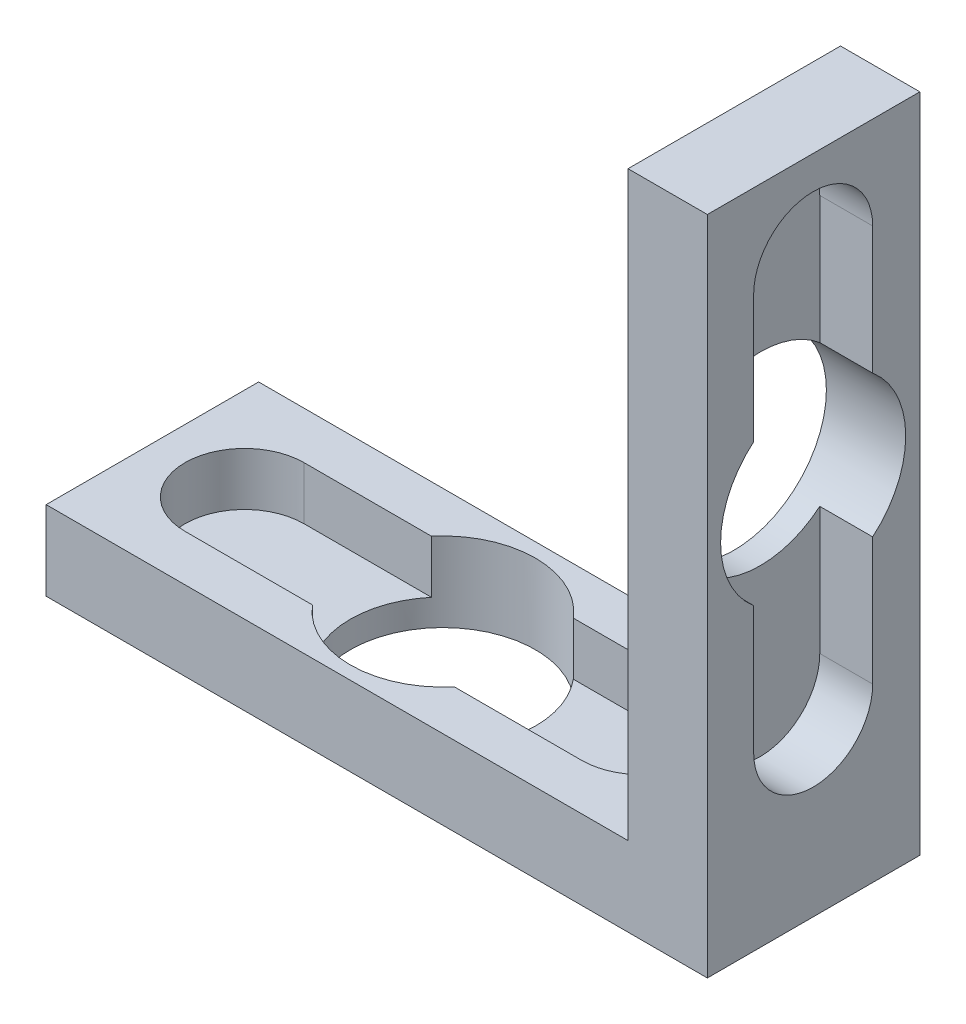
ISO-10303-21;
HEADER;
FILE_DESCRIPTION(('STEP AP214'),'2;1');
FILE_NAME('part.step','',(''),(''),'','','');
FILE_SCHEMA(('AUTOMOTIVE_DESIGN { 1 0 10303 214 1 1 1 1 }'));
ENDSEC;
DATA;
#1=APPLICATION_CONTEXT('core data for automotive mechanical design processes');
#2=APPLICATION_PROTOCOL_DEFINITION('international standard','automotive_design',2000,#1);
#3=PRODUCT_CONTEXT('',#1,'mechanical');
#4=PRODUCT('Part','Part','',(#3));
#5=PRODUCT_RELATED_PRODUCT_CATEGORY('part','',(#4));
#6=PRODUCT_DEFINITION_FORMATION('','',#4);
#7=PRODUCT_DEFINITION_CONTEXT('part definition',#1,'design');
#8=PRODUCT_DEFINITION('design','',#6,#7);
#9=PRODUCT_DEFINITION_SHAPE('','',#8);
#10=(LENGTH_UNIT() NAMED_UNIT(*) SI_UNIT(.MILLI.,.METRE.));
#11=(NAMED_UNIT(*) PLANE_ANGLE_UNIT() SI_UNIT($,.RADIAN.));
#12=(NAMED_UNIT(*) SI_UNIT($,.STERADIAN.) SOLID_ANGLE_UNIT());
#13=UNCERTAINTY_MEASURE_WITH_UNIT(LENGTH_MEASURE(1.E-05),#10,'distance_accuracy_value','');
#14=(GEOMETRIC_REPRESENTATION_CONTEXT(3) GLOBAL_UNCERTAINTY_ASSIGNED_CONTEXT((#13)) GLOBAL_UNIT_ASSIGNED_CONTEXT((#10,
#11,#12)) REPRESENTATION_CONTEXT('',''));
#15=CARTESIAN_POINT('',(0.,0.,0.));
#16=DIRECTION('',(0.,0.,1.));
#17=DIRECTION('',(1.,0.,0.));
#18=AXIS2_PLACEMENT_3D('',#15,#16,#17);
#19=CARTESIAN_POINT('',(0.,3.,0.));
#20=DIRECTION('',(1.,0.,0.));
#21=DIRECTION('',(0.,0.,-1.));
#22=AXIS2_PLACEMENT_3D('',#19,#20,#21);
#23=PLANE('',#22);
#24=DIRECTION('',(0.,0.,1.));
#25=VECTOR('',#24,1.);
#26=CARTESIAN_POINT('',(0.,0.,0.));
#27=LINE('',#26,#25);
#28=CARTESIAN_POINT('',(0.,0.,0.));
#29=VERTEX_POINT('',#28);
#30=CARTESIAN_POINT('',(0.,0.,8.03388090349078));
#31=VERTEX_POINT('',#30);
#32=EDGE_CURVE('E284',#29,#31,#27,.T.);
#33=ORIENTED_EDGE('',*,*,#32,.T.);
#34=DIRECTION('',(0.,-1.,0.));
#35=VECTOR('',#34,1.);
#36=CARTESIAN_POINT('',(0.,3.,8.03388090349078));
#37=LINE('',#36,#35);
#38=CARTESIAN_POINT('',(0.,3.,8.03388090349078));
#39=VERTEX_POINT('',#38);
#40=EDGE_CURVE('E309',#39,#31,#37,.T.);
#41=ORIENTED_EDGE('',*,*,#40,.F.);
#42=DIRECTION('',(0.,0.,1.));
#43=VECTOR('',#42,1.);
#44=CARTESIAN_POINT('',(0.,3.,0.));
#45=LINE('',#44,#43);
#46=CARTESIAN_POINT('',(0.,3.,0.));
#47=VERTEX_POINT('',#46);
#48=EDGE_CURVE('E285',#47,#39,#45,.T.);
#49=ORIENTED_EDGE('',*,*,#48,.F.);
#50=DIRECTION('',(0.,-1.,0.));
#51=VECTOR('',#50,1.);
#52=CARTESIAN_POINT('',(0.,3.,0.));
#53=LINE('',#52,#51);
#54=EDGE_CURVE('E293',#47,#29,#53,.T.);
#55=ORIENTED_EDGE('',*,*,#54,.T.);
#56=EDGE_LOOP('',(#33,#41,#49,#55));
#57=FACE_BOUND('',#56,.T.);
#58=ADVANCED_FACE('F35',(#57),#23,.F.);
#59=CARTESIAN_POINT('',(0.,3.,8.03388090349078));
#60=DIRECTION('',(0.,0.,-1.));
#61=DIRECTION('',(-1.,0.,0.));
#62=AXIS2_PLACEMENT_3D('',#59,#60,#61);
#63=PLANE('',#62);
#64=DIRECTION('',(1.,0.,0.));
#65=VECTOR('',#64,1.);
#66=CARTESIAN_POINT('',(0.,0.,8.03388090349078));
#67=LINE('',#66,#65);
#68=CARTESIAN_POINT('',(25.,0.,8.03388090349078));
#69=VERTEX_POINT('',#68);
#70=EDGE_CURVE('E296',#31,#69,#67,.T.);
#71=ORIENTED_EDGE('',*,*,#70,.T.);
#72=DIRECTION('',(0.,-1.,0.));
#73=VECTOR('',#72,1.);
#74=CARTESIAN_POINT('',(25.,3.,8.03388090349078));
#75=LINE('',#74,#73);
#76=CARTESIAN_POINT('',(25.,25.,8.03388090349078));
#77=VERTEX_POINT('',#76);
#78=EDGE_CURVE('E306',#77,#69,#75,.T.);
#79=ORIENTED_EDGE('',*,*,#78,.F.);
#80=DIRECTION('',(1.,0.,0.));
#81=VECTOR('',#80,1.);
#82=CARTESIAN_POINT('',(25.,25.,8.03388090349078));
#83=LINE('',#82,#81);
#84=CARTESIAN_POINT('',(22.,25.,8.03388090349078));
#85=VERTEX_POINT('',#84);
#86=EDGE_CURVE('E273',#85,#77,#83,.T.);
#87=ORIENTED_EDGE('',*,*,#86,.F.);
#88=DIRECTION('',(0.,-1.,0.));
#89=VECTOR('',#88,1.);
#90=CARTESIAN_POINT('',(22.,25.,8.03388090349078));
#91=LINE('',#90,#89);
#92=CARTESIAN_POINT('',(22.,3.,8.03388090349078));
#93=VERTEX_POINT('',#92);
#94=EDGE_CURVE('E276',#85,#93,#91,.T.);
#95=ORIENTED_EDGE('',*,*,#94,.T.);
#96=DIRECTION('',(1.,0.,0.));
#97=VECTOR('',#96,1.);
#98=CARTESIAN_POINT('',(0.,3.,8.03388090349078));
#99=LINE('',#98,#97);
#100=EDGE_CURVE('E288',#39,#93,#99,.T.);
#101=ORIENTED_EDGE('',*,*,#100,.F.);
#102=ORIENTED_EDGE('',*,*,#40,.T.);
#103=EDGE_LOOP('',(#71,#79,#87,#95,#101,#102));
#104=FACE_BOUND('',#103,.T.);
#105=ADVANCED_FACE('F374',(#104),#63,.F.);
#106=CARTESIAN_POINT('',(25.,3.,0.));
#107=DIRECTION('',(-1.,0.,0.));
#108=DIRECTION('',(0.,0.,1.));
#109=AXIS2_PLACEMENT_3D('',#106,#107,#108);
#110=PLANE('',#109);
#111=DIRECTION('',(0.,-1.,0.));
#112=VECTOR('',#111,1.);
#113=CARTESIAN_POINT('',(25.,6.5,6.28388090349078));
#114=LINE('',#113,#112);
#115=CARTESIAN_POINT('',(25.,21.5,6.28388090349077));
#116=VERTEX_POINT('',#115);
#117=CARTESIAN_POINT('',(25.,16.6809513236909,6.28388090349078));
#118=VERTEX_POINT('',#117);
#119=EDGE_CURVE('E205',#116,#118,#114,.T.);
#120=ORIENTED_EDGE('',*,*,#119,.F.);
#121=CARTESIAN_POINT('',(25.,21.5,4.03388090349078));
#122=DIRECTION('',(1.,0.,0.));
#123=DIRECTION('',(0.,0.,-1.));
#124=AXIS2_PLACEMENT_3D('',#121,#122,#123);
#125=CIRCLE('',#124,2.25);
#126=CARTESIAN_POINT('',(25.,21.5,1.78388090349078));
#127=VERTEX_POINT('',#126);
#128=EDGE_CURVE('E186',#127,#116,#125,.T.);
#129=ORIENTED_EDGE('',*,*,#128,.F.);
#130=DIRECTION('',(0.,1.,0.));
#131=VECTOR('',#130,1.);
#132=CARTESIAN_POINT('',(25.,6.5,1.78388090349078));
#133=LINE('',#132,#131);
#134=CARTESIAN_POINT('',(25.,16.6809513236909,1.78388090349078));
#135=VERTEX_POINT('',#134);
#136=EDGE_CURVE('E202',#135,#127,#133,.T.);
#137=ORIENTED_EDGE('',*,*,#136,.F.);
#138=CARTESIAN_POINT('',(25.,14.,4.03388090349078));
#139=DIRECTION('',(1.,0.,0.));
#140=DIRECTION('',(0.,0.,-1.));
#141=AXIS2_PLACEMENT_3D('',#138,#139,#140);
#142=CIRCLE('',#141,3.5);
#143=CARTESIAN_POINT('',(25.,11.3190486763091,1.78388090349078));
#144=VERTEX_POINT('',#143);
#145=EDGE_CURVE('E217',#144,#135,#142,.T.);
#146=ORIENTED_EDGE('',*,*,#145,.F.);
#147=CARTESIAN_POINT('',(25.,6.5,1.78388090349078));
#148=VERTEX_POINT('',#147);
#149=EDGE_CURVE('E210',#148,#144,#133,.T.);
#150=ORIENTED_EDGE('',*,*,#149,.F.);
#151=CARTESIAN_POINT('',(25.,6.5,4.03388090349078));
#152=DIRECTION('',(1.,0.,0.));
#153=DIRECTION('',(0.,0.,-1.));
#154=AXIS2_PLACEMENT_3D('',#151,#152,#153);
#155=CIRCLE('',#154,2.25);
#156=CARTESIAN_POINT('',(25.,6.5,6.28388090349078));
#157=VERTEX_POINT('',#156);
#158=EDGE_CURVE('E351',#157,#148,#155,.T.);
#159=ORIENTED_EDGE('',*,*,#158,.F.);
#160=CARTESIAN_POINT('',(25.,11.3190486763091,6.28388090349078));
#161=VERTEX_POINT('',#160);
#162=EDGE_CURVE('E213',#161,#157,#114,.T.);
#163=ORIENTED_EDGE('',*,*,#162,.F.);
#164=EDGE_CURVE('E227',#118,#161,#142,.T.);
#165=ORIENTED_EDGE('',*,*,#164,.F.);
#166=EDGE_LOOP('',(#120,#129,#137,#146,#150,#159,#163,#165));
#167=FACE_BOUND('',#166,.T.);
#168=DIRECTION('',(0.,0.,-1.));
#169=VECTOR('',#168,1.);
#170=CARTESIAN_POINT('',(25.,0.,0.));
#171=LINE('',#170,#169);
#172=CARTESIAN_POINT('',(25.,0.,0.));
#173=VERTEX_POINT('',#172);
#174=EDGE_CURVE('E298',#69,#173,#171,.T.);
#175=ORIENTED_EDGE('',*,*,#174,.T.);
#176=DIRECTION('',(0.,-1.,0.));
#177=VECTOR('',#176,1.);
#178=CARTESIAN_POINT('',(25.,3.,0.));
#179=LINE('',#178,#177);
#180=CARTESIAN_POINT('',(25.,25.,0.));
#181=VERTEX_POINT('',#180);
#182=EDGE_CURVE('E303',#181,#173,#179,.T.);
#183=ORIENTED_EDGE('',*,*,#182,.F.);
#184=DIRECTION('',(0.,0.,-1.));
#185=VECTOR('',#184,1.);
#186=CARTESIAN_POINT('',(25.,25.,8.03388090349078));
#187=LINE('',#186,#185);
#188=EDGE_CURVE('E266',#77,#181,#187,.T.);
#189=ORIENTED_EDGE('',*,*,#188,.F.);
#190=ORIENTED_EDGE('',*,*,#78,.T.);
#191=EDGE_LOOP('',(#175,#183,#189,#190));
#192=FACE_BOUND('',#191,.T.);
#193=ADVANCED_FACE('F199',(#167,#192),#110,.F.);
#194=CARTESIAN_POINT('',(0.,3.,0.));
#195=DIRECTION('',(0.,0.,1.));
#196=DIRECTION('',(1.,0.,0.));
#197=AXIS2_PLACEMENT_3D('',#194,#195,#196);
#198=PLANE('',#197);
#199=DIRECTION('',(-1.,0.,0.));
#200=VECTOR('',#199,1.);
#201=CARTESIAN_POINT('',(0.,0.,0.));
#202=LINE('',#201,#200);
#203=EDGE_CURVE('E289',#173,#29,#202,.T.);
#204=ORIENTED_EDGE('',*,*,#203,.T.);
#205=ORIENTED_EDGE('',*,*,#54,.F.);
#206=DIRECTION('',(-1.,0.,0.));
#207=VECTOR('',#206,1.);
#208=CARTESIAN_POINT('',(0.,3.,0.));
#209=LINE('',#208,#207);
#210=CARTESIAN_POINT('',(22.,3.,0.));
#211=VERTEX_POINT('',#210);
#212=EDGE_CURVE('E291',#211,#47,#209,.T.);
#213=ORIENTED_EDGE('',*,*,#212,.F.);
#214=DIRECTION('',(0.,-1.,0.));
#215=VECTOR('',#214,1.);
#216=CARTESIAN_POINT('',(22.,25.,0.));
#217=LINE('',#216,#215);
#218=CARTESIAN_POINT('',(22.,25.,0.));
#219=VERTEX_POINT('',#218);
#220=EDGE_CURVE('E281',#219,#211,#217,.T.);
#221=ORIENTED_EDGE('',*,*,#220,.F.);
#222=DIRECTION('',(-1.,0.,0.));
#223=VECTOR('',#222,1.);
#224=CARTESIAN_POINT('',(25.,25.,0.));
#225=LINE('',#224,#223);
#226=EDGE_CURVE('E269',#181,#219,#225,.T.);
#227=ORIENTED_EDGE('',*,*,#226,.F.);
#228=ORIENTED_EDGE('',*,*,#182,.T.);
#229=EDGE_LOOP('',(#204,#205,#213,#221,#227,#228));
#230=FACE_BOUND('',#229,.T.);
#231=ADVANCED_FACE('F395',(#230),#198,.F.);
#232=CARTESIAN_POINT('',(0.,3.,0.));
#233=DIRECTION('',(0.,1.,0.));
#234=DIRECTION('',(0.,0.,1.));
#235=AXIS2_PLACEMENT_3D('',#232,#233,#234);
#236=PLANE('',#235);
#237=CARTESIAN_POINT('',(3.5,3.,4.03388090349078));
#238=DIRECTION('',(0.,1.,0.));
#239=DIRECTION('',(0.,0.,1.));
#240=AXIS2_PLACEMENT_3D('',#237,#238,#239);
#241=CIRCLE('',#240,2.25);
#242=CARTESIAN_POINT('',(3.5,3.,1.78388090349078));
#243=VERTEX_POINT('',#242);
#244=CARTESIAN_POINT('',(3.5,3.,6.28388090349078));
#245=VERTEX_POINT('',#244);
#246=EDGE_CURVE('E226',#243,#245,#241,.T.);
#247=ORIENTED_EDGE('',*,*,#246,.F.);
#248=DIRECTION('',(-1.,0.,0.));
#249=VECTOR('',#248,1.);
#250=CARTESIAN_POINT('',(18.5,3.,1.78388090349078));
#251=LINE('',#250,#249);
#252=CARTESIAN_POINT('',(8.3190486763091,3.,1.78388090349078));
#253=VERTEX_POINT('',#252);
#254=EDGE_CURVE('E235',#253,#243,#251,.T.);
#255=ORIENTED_EDGE('',*,*,#254,.F.);
#256=CARTESIAN_POINT('',(11.,3.,4.03388090349078));
#257=DIRECTION('',(0.,1.,0.));
#258=DIRECTION('',(0.,0.,1.));
#259=AXIS2_PLACEMENT_3D('',#256,#257,#258);
#260=CIRCLE('',#259,3.5);
#261=CARTESIAN_POINT('',(13.6809513236909,3.,1.78388090349078));
#262=VERTEX_POINT('',#261);
#263=EDGE_CURVE('E263',#262,#253,#260,.T.);
#264=ORIENTED_EDGE('',*,*,#263,.F.);
#265=CARTESIAN_POINT('',(18.5,3.,1.78388090349078));
#266=VERTEX_POINT('',#265);
#267=EDGE_CURVE('E244',#266,#262,#251,.T.);
#268=ORIENTED_EDGE('',*,*,#267,.F.);
#269=CARTESIAN_POINT('',(18.5,3.,4.03388090349078));
#270=DIRECTION('',(0.,1.,0.));
#271=DIRECTION('',(0.,0.,1.));
#272=AXIS2_PLACEMENT_3D('',#269,#270,#271);
#273=CIRCLE('',#272,2.25);
#274=CARTESIAN_POINT('',(18.5,3.,6.28388090349077));
#275=VERTEX_POINT('',#274);
#276=EDGE_CURVE('E231',#275,#266,#273,.T.);
#277=ORIENTED_EDGE('',*,*,#276,.F.);
#278=DIRECTION('',(1.,0.,0.));
#279=VECTOR('',#278,1.);
#280=CARTESIAN_POINT('',(18.5,3.,6.28388090349078));
#281=LINE('',#280,#279);
#282=CARTESIAN_POINT('',(13.6809513236909,3.,6.28388090349078));
#283=VERTEX_POINT('',#282);
#284=EDGE_CURVE('E246',#283,#275,#281,.T.);
#285=ORIENTED_EDGE('',*,*,#284,.F.);
#286=CARTESIAN_POINT('',(8.3190486763091,3.,6.28388090349078));
#287=VERTEX_POINT('',#286);
#288=EDGE_CURVE('E251',#287,#283,#260,.T.);
#289=ORIENTED_EDGE('',*,*,#288,.F.);
#290=EDGE_CURVE('E247',#245,#287,#281,.T.);
#291=ORIENTED_EDGE('',*,*,#290,.F.);
#292=EDGE_LOOP('',(#247,#255,#264,#268,#277,#285,#289,#291));
#293=FACE_BOUND('',#292,.T.);
#294=DIRECTION('',(0.,0.,1.));
#295=VECTOR('',#294,1.);
#296=CARTESIAN_POINT('',(22.,3.,8.03388090349078));
#297=LINE('',#296,#295);
#298=EDGE_CURVE('E262',#211,#93,#297,.T.);
#299=ORIENTED_EDGE('',*,*,#298,.F.);
#300=ORIENTED_EDGE('',*,*,#212,.T.);
#301=ORIENTED_EDGE('',*,*,#48,.T.);
#302=ORIENTED_EDGE('',*,*,#100,.T.);
#303=EDGE_LOOP('',(#299,#300,#301,#302));
#304=FACE_BOUND('',#303,.T.);
#305=ADVANCED_FACE('F391',(#293,#304),#236,.T.);
#306=CARTESIAN_POINT('',(0.,0.,0.));
#307=DIRECTION('',(0.,1.,0.));
#308=DIRECTION('',(0.,0.,1.));
#309=AXIS2_PLACEMENT_3D('',#306,#307,#308);
#310=PLANE('',#309);
#311=CARTESIAN_POINT('',(11.,0.,4.03388090349078));
#312=DIRECTION('',(0.,1.,0.));
#313=DIRECTION('',(0.,0.,1.));
#314=AXIS2_PLACEMENT_3D('',#311,#312,#313);
#315=CIRCLE('',#314,3.5);
#316=CARTESIAN_POINT('',(11.,0.,7.53388090349078));
#317=VERTEX_POINT('',#316);
#318=EDGE_CURVE('E259',#317,#317,#315,.T.);
#319=ORIENTED_EDGE('',*,*,#318,.T.);
#320=EDGE_LOOP('',(#319));
#321=FACE_BOUND('',#320,.T.);
#322=ORIENTED_EDGE('',*,*,#32,.F.);
#323=ORIENTED_EDGE('',*,*,#203,.F.);
#324=ORIENTED_EDGE('',*,*,#174,.F.);
#325=ORIENTED_EDGE('',*,*,#70,.F.);
#326=EDGE_LOOP('',(#322,#323,#324,#325));
#327=FACE_BOUND('',#326,.T.);
#328=ADVANCED_FACE('F386',(#321,#327),#310,.F.);
#329=CARTESIAN_POINT('',(22.,25.,8.03388090349078));
#330=DIRECTION('',(1.,0.,0.));
#331=DIRECTION('',(0.,0.,-1.));
#332=AXIS2_PLACEMENT_3D('',#329,#330,#331);
#333=PLANE('',#332);
#334=CARTESIAN_POINT('',(22.,14.,4.03388090349078));
#335=DIRECTION('',(1.,0.,0.));
#336=DIRECTION('',(0.,0.,-1.));
#337=AXIS2_PLACEMENT_3D('',#334,#335,#336);
#338=CIRCLE('',#337,3.5);
#339=CARTESIAN_POINT('',(22.,14.,0.533880903490777));
#340=VERTEX_POINT('',#339);
#341=EDGE_CURVE('E223',#340,#340,#338,.T.);
#342=ORIENTED_EDGE('',*,*,#341,.T.);
#343=EDGE_LOOP('',(#342));
#344=FACE_BOUND('',#343,.T.);
#345=ORIENTED_EDGE('',*,*,#298,.T.);
#346=ORIENTED_EDGE('',*,*,#94,.F.);
#347=DIRECTION('',(0.,0.,1.));
#348=VECTOR('',#347,1.);
#349=CARTESIAN_POINT('',(22.,25.,8.03388090349078));
#350=LINE('',#349,#348);
#351=EDGE_CURVE('E271',#219,#85,#350,.T.);
#352=ORIENTED_EDGE('',*,*,#351,.F.);
#353=ORIENTED_EDGE('',*,*,#220,.T.);
#354=EDGE_LOOP('',(#345,#346,#352,#353));
#355=FACE_BOUND('',#354,.T.);
#356=ADVANCED_FACE('F402',(#344,#355),#333,.F.);
#357=CARTESIAN_POINT('',(0.,25.,0.));
#358=DIRECTION('',(0.,1.,0.));
#359=DIRECTION('',(0.,0.,1.));
#360=AXIS2_PLACEMENT_3D('',#357,#358,#359);
#361=PLANE('',#360);
#362=ORIENTED_EDGE('',*,*,#188,.T.);
#363=ORIENTED_EDGE('',*,*,#226,.T.);
#364=ORIENTED_EDGE('',*,*,#351,.T.);
#365=ORIENTED_EDGE('',*,*,#86,.T.);
#366=EDGE_LOOP('',(#362,#363,#364,#365));
#367=FACE_BOUND('',#366,.T.);
#368=ADVANCED_FACE('F399',(#367),#361,.T.);
#369=CARTESIAN_POINT('',(11.,0.,4.03388090349078));
#370=DIRECTION('',(0.,1.,0.));
#371=DIRECTION('',(0.,0.,1.));
#372=AXIS2_PLACEMENT_3D('',#369,#370,#371);
#373=CYLINDRICAL_SURFACE('',#372,3.5);
#374=CARTESIAN_POINT('',(11.,1.,4.03388090349078));
#375=DIRECTION('',(0.,1.,0.));
#376=DIRECTION('',(0.,0.,1.));
#377=AXIS2_PLACEMENT_3D('',#374,#375,#376);
#378=CIRCLE('',#377,3.5);
#379=CARTESIAN_POINT('',(8.3190486763091,1.,6.28388090349078));
#380=VERTEX_POINT('',#379);
#381=CARTESIAN_POINT('',(8.3190486763091,1.,1.78388090349078));
#382=VERTEX_POINT('',#381);
#383=EDGE_CURVE('E315',#380,#382,#378,.F.);
#384=ORIENTED_EDGE('',*,*,#383,.F.);
#385=DIRECTION('',(0.,1.,0.));
#386=VECTOR('',#385,1.);
#387=CARTESIAN_POINT('',(8.3190486763091,0.,6.28388090349078));
#388=LINE('',#387,#386);
#389=EDGE_CURVE('E324',#380,#287,#388,.T.);
#390=ORIENTED_EDGE('',*,*,#389,.T.);
#391=ORIENTED_EDGE('',*,*,#288,.T.);
#392=DIRECTION('',(0.,1.,0.));
#393=VECTOR('',#392,1.);
#394=CARTESIAN_POINT('',(13.6809513236909,0.,6.28388090349078));
#395=LINE('',#394,#393);
#396=CARTESIAN_POINT('',(13.6809513236909,1.,6.28388090349078));
#397=VERTEX_POINT('',#396);
#398=EDGE_CURVE('E318',#283,#397,#395,.F.);
#399=ORIENTED_EDGE('',*,*,#398,.T.);
#400=CARTESIAN_POINT('',(13.6809513236909,1.,1.78388090349078));
#401=VERTEX_POINT('',#400);
#402=EDGE_CURVE('E312',#401,#397,#378,.F.);
#403=ORIENTED_EDGE('',*,*,#402,.F.);
#404=DIRECTION('',(0.,1.,0.));
#405=VECTOR('',#404,1.);
#406=CARTESIAN_POINT('',(13.6809513236909,0.,1.78388090349078));
#407=LINE('',#406,#405);
#408=EDGE_CURVE('E314',#401,#262,#407,.T.);
#409=ORIENTED_EDGE('',*,*,#408,.T.);
#410=ORIENTED_EDGE('',*,*,#263,.T.);
#411=DIRECTION('',(0.,1.,0.));
#412=VECTOR('',#411,1.);
#413=CARTESIAN_POINT('',(8.3190486763091,0.,1.78388090349078));
#414=LINE('',#413,#412);
#415=EDGE_CURVE('E321',#253,#382,#414,.F.);
#416=ORIENTED_EDGE('',*,*,#415,.T.);
#417=EDGE_LOOP('',(#384,#390,#391,#399,#403,#409,#410,#416));
#418=FACE_BOUND('',#417,.T.);
#419=ORIENTED_EDGE('',*,*,#318,.F.);
#420=EDGE_LOOP('',(#419));
#421=FACE_BOUND('',#420,.T.);
#422=ADVANCED_FACE('F410',(#418,#421),#373,.F.);
#423=CARTESIAN_POINT('',(0.,1.,0.));
#424=DIRECTION('',(0.,1.,0.));
#425=DIRECTION('',(0.,0.,1.));
#426=AXIS2_PLACEMENT_3D('',#423,#424,#425);
#427=PLANE('',#426);
#428=DIRECTION('',(1.,0.,0.));
#429=VECTOR('',#428,1.);
#430=CARTESIAN_POINT('',(18.5,1.,6.28388090349078));
#431=LINE('',#430,#429);
#432=CARTESIAN_POINT('',(18.5,1.,6.28388090349077));
#433=VERTEX_POINT('',#432);
#434=EDGE_CURVE('E239',#397,#433,#431,.T.);
#435=ORIENTED_EDGE('',*,*,#434,.T.);
#436=CARTESIAN_POINT('',(18.5,1.,4.03388090349078));
#437=DIRECTION('',(0.,1.,0.));
#438=DIRECTION('',(0.,0.,1.));
#439=AXIS2_PLACEMENT_3D('',#436,#437,#438);
#440=CIRCLE('',#439,2.25);
#441=CARTESIAN_POINT('',(18.5,1.,1.78388090349078));
#442=VERTEX_POINT('',#441);
#443=EDGE_CURVE('E233',#433,#442,#440,.T.);
#444=ORIENTED_EDGE('',*,*,#443,.T.);
#445=DIRECTION('',(-1.,0.,0.));
#446=VECTOR('',#445,1.);
#447=CARTESIAN_POINT('',(18.5,1.,1.78388090349078));
#448=LINE('',#447,#446);
#449=EDGE_CURVE('E237',#442,#401,#448,.T.);
#450=ORIENTED_EDGE('',*,*,#449,.T.);
#451=ORIENTED_EDGE('',*,*,#402,.T.);
#452=EDGE_LOOP('',(#435,#444,#450,#451));
#453=FACE_BOUND('',#452,.T.);
#454=ADVANCED_FACE('F453',(#453),#427,.T.);
#455=CARTESIAN_POINT('',(18.5,1.,1.78388090349078));
#456=DIRECTION('',(0.,0.,-1.));
#457=DIRECTION('',(-1.,0.,0.));
#458=AXIS2_PLACEMENT_3D('',#455,#456,#457);
#459=PLANE('',#458);
#460=ORIENTED_EDGE('',*,*,#449,.F.);
#461=DIRECTION('',(0.,1.,0.));
#462=VECTOR('',#461,1.);
#463=CARTESIAN_POINT('',(18.5,1.,1.78388090349078));
#464=LINE('',#463,#462);
#465=EDGE_CURVE('E243',#442,#266,#464,.T.);
#466=ORIENTED_EDGE('',*,*,#465,.T.);
#467=ORIENTED_EDGE('',*,*,#267,.T.);
#468=ORIENTED_EDGE('',*,*,#408,.F.);
#469=EDGE_LOOP('',(#460,#466,#467,#468));
#470=FACE_BOUND('',#469,.T.);
#471=ADVANCED_FACE('F463',(#470),#459,.F.);
#472=CARTESIAN_POINT('',(18.5,1.,6.28388090349078));
#473=DIRECTION('',(0.,0.,1.));
#474=DIRECTION('',(1.,0.,0.));
#475=AXIS2_PLACEMENT_3D('',#472,#473,#474);
#476=PLANE('',#475);
#477=ORIENTED_EDGE('',*,*,#284,.T.);
#478=DIRECTION('',(0.,1.,0.));
#479=VECTOR('',#478,1.);
#480=CARTESIAN_POINT('',(18.5,1.,6.28388090349078));
#481=LINE('',#480,#479);
#482=EDGE_CURVE('E249',#433,#275,#481,.T.);
#483=ORIENTED_EDGE('',*,*,#482,.F.);
#484=ORIENTED_EDGE('',*,*,#434,.F.);
#485=ORIENTED_EDGE('',*,*,#398,.F.);
#486=EDGE_LOOP('',(#477,#483,#484,#485));
#487=FACE_BOUND('',#486,.T.);
#488=ADVANCED_FACE('F472',(#487),#476,.F.);
#489=CARTESIAN_POINT('',(3.5,1.,6.28388090349078));
#490=VERTEX_POINT('',#489);
#491=EDGE_CURVE('E241',#490,#380,#431,.T.);
#492=ORIENTED_EDGE('',*,*,#491,.F.);
#493=DIRECTION('',(0.,1.,0.));
#494=VECTOR('',#493,1.);
#495=CARTESIAN_POINT('',(3.5,1.,6.28388090349078));
#496=LINE('',#495,#494);
#497=EDGE_CURVE('E252',#490,#245,#496,.T.);
#498=ORIENTED_EDGE('',*,*,#497,.T.);
#499=ORIENTED_EDGE('',*,*,#290,.T.);
#500=ORIENTED_EDGE('',*,*,#389,.F.);
#501=EDGE_LOOP('',(#492,#498,#499,#500));
#502=FACE_BOUND('',#501,.T.);
#503=ADVANCED_FACE('F481',(#502),#476,.F.);
#504=ORIENTED_EDGE('',*,*,#254,.T.);
#505=DIRECTION('',(0.,1.,0.));
#506=VECTOR('',#505,1.);
#507=CARTESIAN_POINT('',(3.5,1.,1.78388090349078));
#508=LINE('',#507,#506);
#509=CARTESIAN_POINT('',(3.5,1.,1.78388090349078));
#510=VERTEX_POINT('',#509);
#511=EDGE_CURVE('E255',#510,#243,#508,.T.);
#512=ORIENTED_EDGE('',*,*,#511,.F.);
#513=EDGE_CURVE('E240',#382,#510,#448,.T.);
#514=ORIENTED_EDGE('',*,*,#513,.F.);
#515=ORIENTED_EDGE('',*,*,#415,.F.);
#516=EDGE_LOOP('',(#504,#512,#514,#515));
#517=FACE_BOUND('',#516,.T.);
#518=ADVANCED_FACE('F475',(#517),#459,.F.);
#519=ORIENTED_EDGE('',*,*,#513,.T.);
#520=CARTESIAN_POINT('',(3.5,1.,4.03388090349078));
#521=DIRECTION('',(0.,1.,0.));
#522=DIRECTION('',(0.,0.,1.));
#523=AXIS2_PLACEMENT_3D('',#520,#521,#522);
#524=CIRCLE('',#523,2.25);
#525=EDGE_CURVE('E229',#510,#490,#524,.T.);
#526=ORIENTED_EDGE('',*,*,#525,.T.);
#527=ORIENTED_EDGE('',*,*,#491,.T.);
#528=ORIENTED_EDGE('',*,*,#383,.T.);
#529=EDGE_LOOP('',(#519,#526,#527,#528));
#530=FACE_BOUND('',#529,.T.);
#531=ADVANCED_FACE('F466',(#530),#427,.T.);
#532=CARTESIAN_POINT('',(18.5,1.,4.03388090349078));
#533=DIRECTION('',(0.,1.,0.));
#534=DIRECTION('',(0.,0.,1.));
#535=AXIS2_PLACEMENT_3D('',#532,#533,#534);
#536=CYLINDRICAL_SURFACE('',#535,2.25);
#537=ORIENTED_EDGE('',*,*,#443,.F.);
#538=ORIENTED_EDGE('',*,*,#482,.T.);
#539=ORIENTED_EDGE('',*,*,#276,.T.);
#540=ORIENTED_EDGE('',*,*,#465,.F.);
#541=EDGE_LOOP('',(#537,#538,#539,#540));
#542=FACE_BOUND('',#541,.T.);
#543=ADVANCED_FACE('F501',(#542),#536,.F.);
#544=CARTESIAN_POINT('',(3.5,1.,4.03388090349078));
#545=DIRECTION('',(0.,1.,0.));
#546=DIRECTION('',(0.,0.,1.));
#547=AXIS2_PLACEMENT_3D('',#544,#545,#546);
#548=CYLINDRICAL_SURFACE('',#547,2.25);
#549=ORIENTED_EDGE('',*,*,#525,.F.);
#550=ORIENTED_EDGE('',*,*,#511,.T.);
#551=ORIENTED_EDGE('',*,*,#246,.T.);
#552=ORIENTED_EDGE('',*,*,#497,.F.);
#553=EDGE_LOOP('',(#549,#550,#551,#552));
#554=FACE_BOUND('',#553,.T.);
#555=ADVANCED_FACE('F508',(#554),#548,.F.);
#556=CARTESIAN_POINT('',(22.,14.,4.03388090349078));
#557=DIRECTION('',(1.,0.,0.));
#558=DIRECTION('',(0.,0.,-1.));
#559=AXIS2_PLACEMENT_3D('',#556,#557,#558);
#560=CYLINDRICAL_SURFACE('',#559,3.5);
#561=ORIENTED_EDGE('',*,*,#164,.T.);
#562=DIRECTION('',(1.,0.,0.));
#563=VECTOR('',#562,1.);
#564=CARTESIAN_POINT('',(22.,11.3190486763091,6.28388090349078));
#565=LINE('',#564,#563);
#566=CARTESIAN_POINT('',(23.,11.3190486763091,6.28388090349078));
#567=VERTEX_POINT('',#566);
#568=EDGE_CURVE('E11',#161,#567,#565,.F.);
#569=ORIENTED_EDGE('',*,*,#568,.T.);
#570=CARTESIAN_POINT('',(23.,14.,4.03388090349078));
#571=DIRECTION('',(-1.,0.,0.));
#572=DIRECTION('',(0.,0.,1.));
#573=AXIS2_PLACEMENT_3D('',#570,#571,#572);
#574=CIRCLE('',#573,3.5);
#575=CARTESIAN_POINT('',(23.,11.3190486763091,1.78388090349078));
#576=VERTEX_POINT('',#575);
#577=EDGE_CURVE('E330',#567,#576,#574,.F.);
#578=ORIENTED_EDGE('',*,*,#577,.T.);
#579=DIRECTION('',(1.,0.,0.));
#580=VECTOR('',#579,1.);
#581=CARTESIAN_POINT('',(22.,11.3190486763091,1.78388090349078));
#582=LINE('',#581,#580);
#583=EDGE_CURVE('E42',#576,#144,#582,.T.);
#584=ORIENTED_EDGE('',*,*,#583,.T.);
#585=ORIENTED_EDGE('',*,*,#145,.T.);
#586=DIRECTION('',(1.,0.,0.));
#587=VECTOR('',#586,1.);
#588=CARTESIAN_POINT('',(22.,16.6809513236909,1.78388090349078));
#589=LINE('',#588,#587);
#590=CARTESIAN_POINT('',(23.,16.6809513236909,1.78388090349078));
#591=VERTEX_POINT('',#590);
#592=EDGE_CURVE('E209',#135,#591,#589,.F.);
#593=ORIENTED_EDGE('',*,*,#592,.T.);
#594=CARTESIAN_POINT('',(23.,16.6809513236909,6.28388090349078));
#595=VERTEX_POINT('',#594);
#596=EDGE_CURVE('E327',#591,#595,#574,.F.);
#597=ORIENTED_EDGE('',*,*,#596,.T.);
#598=DIRECTION('',(1.,0.,0.));
#599=VECTOR('',#598,1.);
#600=CARTESIAN_POINT('',(22.,16.6809513236909,6.28388090349078));
#601=LINE('',#600,#599);
#602=EDGE_CURVE('E332',#595,#118,#601,.T.);
#603=ORIENTED_EDGE('',*,*,#602,.T.);
#604=EDGE_LOOP('',(#561,#569,#578,#584,#585,#593,#597,#603));
#605=FACE_BOUND('',#604,.T.);
#606=ORIENTED_EDGE('',*,*,#341,.F.);
#607=EDGE_LOOP('',(#606));
#608=FACE_BOUND('',#607,.T.);
#609=ADVANCED_FACE('F338',(#605,#608),#560,.F.);
#610=CARTESIAN_POINT('',(23.,0.,0.));
#611=DIRECTION('',(-1.,0.,0.));
#612=DIRECTION('',(0.,0.,1.));
#613=AXIS2_PLACEMENT_3D('',#610,#611,#612);
#614=PLANE('',#613);
#615=DIRECTION('',(0.,1.,0.));
#616=VECTOR('',#615,1.);
#617=CARTESIAN_POINT('',(23.,6.5,1.78388090349078));
#618=LINE('',#617,#616);
#619=CARTESIAN_POINT('',(23.,21.5,1.78388090349078));
#620=VERTEX_POINT('',#619);
#621=EDGE_CURVE('E349',#591,#620,#618,.T.);
#622=ORIENTED_EDGE('',*,*,#621,.T.);
#623=CARTESIAN_POINT('',(23.,21.5,4.03388090349078));
#624=DIRECTION('',(1.,0.,0.));
#625=DIRECTION('',(0.,0.,-1.));
#626=AXIS2_PLACEMENT_3D('',#623,#624,#625);
#627=CIRCLE('',#626,2.25);
#628=CARTESIAN_POINT('',(23.,21.5,6.28388090349078));
#629=VERTEX_POINT('',#628);
#630=EDGE_CURVE('E188',#620,#629,#627,.T.);
#631=ORIENTED_EDGE('',*,*,#630,.T.);
#632=DIRECTION('',(0.,-1.,0.));
#633=VECTOR('',#632,1.);
#634=CARTESIAN_POINT('',(23.,6.5,6.28388090349078));
#635=LINE('',#634,#633);
#636=EDGE_CURVE('E57',#629,#595,#635,.T.);
#637=ORIENTED_EDGE('',*,*,#636,.T.);
#638=ORIENTED_EDGE('',*,*,#596,.F.);
#639=EDGE_LOOP('',(#622,#631,#637,#638));
#640=FACE_BOUND('',#639,.T.);
#641=ADVANCED_FACE('F353',(#640),#614,.F.);
#642=CARTESIAN_POINT('',(23.,6.5,1.78388090349078));
#643=DIRECTION('',(0.,0.,-1.));
#644=DIRECTION('',(-1.,0.,0.));
#645=AXIS2_PLACEMENT_3D('',#642,#643,#644);
#646=PLANE('',#645);
#647=ORIENTED_EDGE('',*,*,#136,.T.);
#648=DIRECTION('',(1.,0.,0.));
#649=VECTOR('',#648,1.);
#650=CARTESIAN_POINT('',(23.,21.5,1.78388090349078));
#651=LINE('',#650,#649);
#652=EDGE_CURVE('E182',#620,#127,#651,.T.);
#653=ORIENTED_EDGE('',*,*,#652,.F.);
#654=ORIENTED_EDGE('',*,*,#621,.F.);
#655=ORIENTED_EDGE('',*,*,#592,.F.);
#656=EDGE_LOOP('',(#647,#653,#654,#655));
#657=FACE_BOUND('',#656,.T.);
#658=ADVANCED_FACE('F207',(#657),#646,.F.);
#659=CARTESIAN_POINT('',(23.,6.5,6.28388090349078));
#660=DIRECTION('',(0.,0.,1.));
#661=DIRECTION('',(1.,0.,0.));
#662=AXIS2_PLACEMENT_3D('',#659,#660,#661);
#663=PLANE('',#662);
#664=ORIENTED_EDGE('',*,*,#636,.F.);
#665=DIRECTION('',(1.,0.,0.));
#666=VECTOR('',#665,1.);
#667=CARTESIAN_POINT('',(23.,21.5,6.28388090349078));
#668=LINE('',#667,#666);
#669=EDGE_CURVE('E193',#629,#116,#668,.T.);
#670=ORIENTED_EDGE('',*,*,#669,.T.);
#671=ORIENTED_EDGE('',*,*,#119,.T.);
#672=ORIENTED_EDGE('',*,*,#602,.F.);
#673=EDGE_LOOP('',(#664,#670,#671,#672));
#674=FACE_BOUND('',#673,.T.);
#675=ADVANCED_FACE('F364',(#674),#663,.F.);
#676=ORIENTED_EDGE('',*,*,#162,.T.);
#677=DIRECTION('',(1.,0.,0.));
#678=VECTOR('',#677,1.);
#679=CARTESIAN_POINT('',(23.,6.5,6.28388090349078));
#680=LINE('',#679,#678);
#681=CARTESIAN_POINT('',(23.,6.5,6.28388090349078));
#682=VERTEX_POINT('',#681);
#683=EDGE_CURVE('E221',#682,#157,#680,.T.);
#684=ORIENTED_EDGE('',*,*,#683,.F.);
#685=EDGE_CURVE('E212',#567,#682,#635,.T.);
#686=ORIENTED_EDGE('',*,*,#685,.F.);
#687=ORIENTED_EDGE('',*,*,#568,.F.);
#688=EDGE_LOOP('',(#676,#684,#686,#687));
#689=FACE_BOUND('',#688,.T.);
#690=ADVANCED_FACE('F346',(#689),#663,.F.);
#691=CARTESIAN_POINT('',(23.,6.5,1.78388090349078));
#692=VERTEX_POINT('',#691);
#693=EDGE_CURVE('E49',#692,#576,#618,.T.);
#694=ORIENTED_EDGE('',*,*,#693,.F.);
#695=DIRECTION('',(1.,0.,0.));
#696=VECTOR('',#695,1.);
#697=CARTESIAN_POINT('',(23.,6.5,1.78388090349078));
#698=LINE('',#697,#696);
#699=EDGE_CURVE('E194',#692,#148,#698,.T.);
#700=ORIENTED_EDGE('',*,*,#699,.T.);
#701=ORIENTED_EDGE('',*,*,#149,.T.);
#702=ORIENTED_EDGE('',*,*,#583,.F.);
#703=EDGE_LOOP('',(#694,#700,#701,#702));
#704=FACE_BOUND('',#703,.T.);
#705=ADVANCED_FACE('F357',(#704),#646,.F.);
#706=ORIENTED_EDGE('',*,*,#685,.T.);
#707=CARTESIAN_POINT('',(23.,6.5,4.03388090349078));
#708=DIRECTION('',(1.,0.,0.));
#709=DIRECTION('',(0.,0.,-1.));
#710=AXIS2_PLACEMENT_3D('',#707,#708,#709);
#711=CIRCLE('',#710,2.25);
#712=EDGE_CURVE('E361',#682,#692,#711,.T.);
#713=ORIENTED_EDGE('',*,*,#712,.T.);
#714=ORIENTED_EDGE('',*,*,#693,.T.);
#715=ORIENTED_EDGE('',*,*,#577,.F.);
#716=EDGE_LOOP('',(#706,#713,#714,#715));
#717=FACE_BOUND('',#716,.T.);
#718=ADVANCED_FACE('F342',(#717),#614,.F.);
#719=CARTESIAN_POINT('',(23.,6.5,4.03388090349078));
#720=DIRECTION('',(1.,0.,0.));
#721=DIRECTION('',(0.,0.,-1.));
#722=AXIS2_PLACEMENT_3D('',#719,#720,#721);
#723=CYLINDRICAL_SURFACE('',#722,2.25);
#724=ORIENTED_EDGE('',*,*,#712,.F.);
#725=ORIENTED_EDGE('',*,*,#683,.T.);
#726=ORIENTED_EDGE('',*,*,#158,.T.);
#727=ORIENTED_EDGE('',*,*,#699,.F.);
#728=EDGE_LOOP('',(#724,#725,#726,#727));
#729=FACE_BOUND('',#728,.T.);
#730=ADVANCED_FACE('F360',(#729),#723,.F.);
#731=CARTESIAN_POINT('',(23.,21.5,4.03388090349078));
#732=DIRECTION('',(1.,0.,0.));
#733=DIRECTION('',(0.,0.,-1.));
#734=AXIS2_PLACEMENT_3D('',#731,#732,#733);
#735=CYLINDRICAL_SURFACE('',#734,2.25);
#736=ORIENTED_EDGE('',*,*,#630,.F.);
#737=ORIENTED_EDGE('',*,*,#652,.T.);
#738=ORIENTED_EDGE('',*,*,#128,.T.);
#739=ORIENTED_EDGE('',*,*,#669,.F.);
#740=EDGE_LOOP('',(#736,#737,#738,#739));
#741=FACE_BOUND('',#740,.T.);
#742=ADVANCED_FACE('F184',(#741),#735,.F.);
#743=CLOSED_SHELL('',(#58,#105,#193,#231,#305,#328,#356,#368,#422,#454,#471,#488,#503,#518,#531,
#543,#555,#609,#641,#658,#675,#690,#705,#718,#730,#742));
#744=MANIFOLD_SOLID_BREP('B2',#743);
#745=ADVANCED_BREP_SHAPE_REPRESENTATION('',(#18,#744),#14);
#746=SHAPE_DEFINITION_REPRESENTATION(#9,#745);
ENDSEC;
END-ISO-10303-21;
